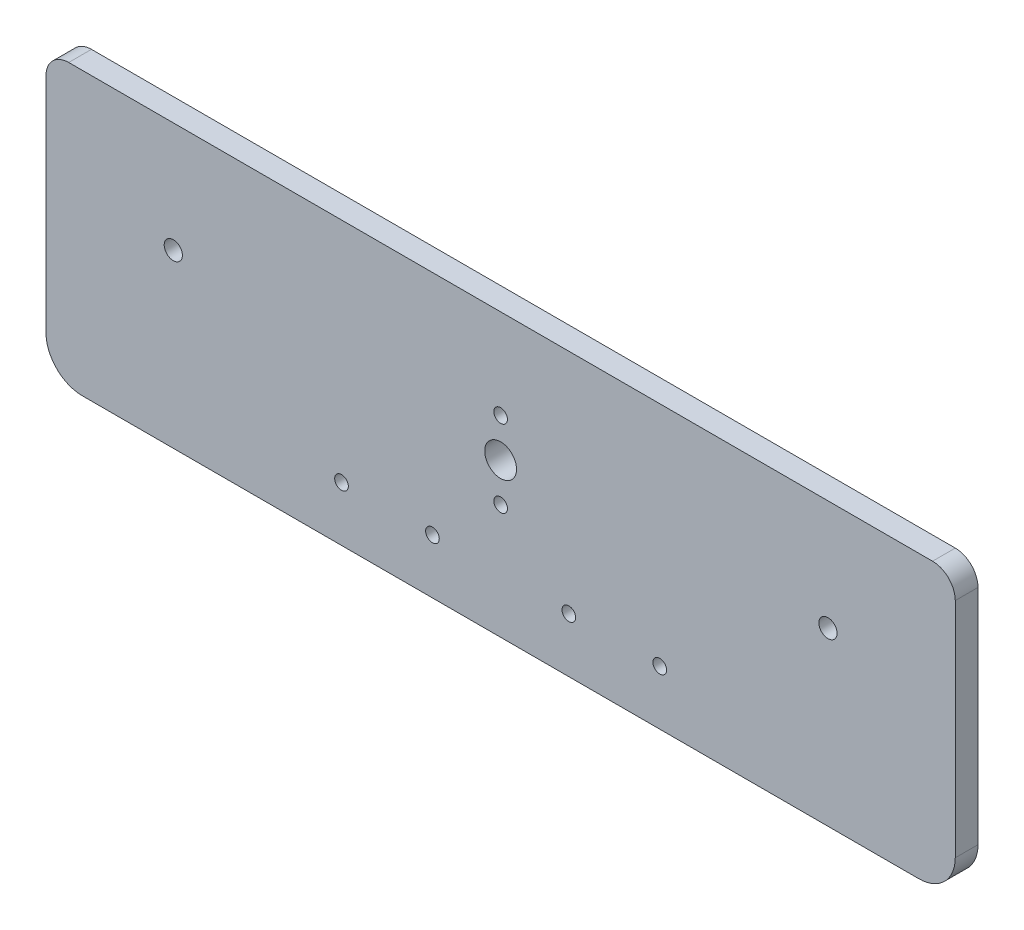
ISO-10303-21;
HEADER;
FILE_DESCRIPTION(('STEP AP214'),'2;1');
FILE_NAME('part.step','',(''),(''),'','','');
FILE_SCHEMA(('AUTOMOTIVE_DESIGN { 1 0 10303 214 1 1 1 1 }'));
ENDSEC;
DATA;
#1=APPLICATION_CONTEXT('core data for automotive mechanical design processes');
#2=APPLICATION_PROTOCOL_DEFINITION('international standard','automotive_design',2000,#1);
#3=PRODUCT_CONTEXT('',#1,'mechanical');
#4=PRODUCT('Part','Part','',(#3));
#5=PRODUCT_RELATED_PRODUCT_CATEGORY('part','',(#4));
#6=PRODUCT_DEFINITION_FORMATION('','',#4);
#7=PRODUCT_DEFINITION_CONTEXT('part definition',#1,'design');
#8=PRODUCT_DEFINITION('design','',#6,#7);
#9=PRODUCT_DEFINITION_SHAPE('','',#8);
#10=(LENGTH_UNIT() NAMED_UNIT(*) SI_UNIT(.MILLI.,.METRE.));
#11=(NAMED_UNIT(*) PLANE_ANGLE_UNIT() SI_UNIT($,.RADIAN.));
#12=(NAMED_UNIT(*) SI_UNIT($,.STERADIAN.) SOLID_ANGLE_UNIT());
#13=UNCERTAINTY_MEASURE_WITH_UNIT(LENGTH_MEASURE(1.E-05),#10,'distance_accuracy_value','');
#14=(GEOMETRIC_REPRESENTATION_CONTEXT(3) GLOBAL_UNCERTAINTY_ASSIGNED_CONTEXT((#13)) GLOBAL_UNIT_ASSIGNED_CONTEXT((#10,
#11,#12)) REPRESENTATION_CONTEXT('',''));
#15=CARTESIAN_POINT('',(0.,0.,0.));
#16=DIRECTION('',(0.,0.,1.));
#17=DIRECTION('',(1.,0.,0.));
#18=AXIS2_PLACEMENT_3D('',#15,#16,#17);
#19=CARTESIAN_POINT('',(-100.,0.,5.));
#20=DIRECTION('',(1.,0.,0.));
#21=DIRECTION('',(0.,0.,-1.));
#22=AXIS2_PLACEMENT_3D('',#19,#20,#21);
#23=PLANE('',#22);
#24=DIRECTION('',(0.,-1.,0.));
#25=VECTOR('',#24,1.);
#26=CARTESIAN_POINT('',(-100.,0.,5.));
#27=LINE('',#26,#25);
#28=CARTESIAN_POINT('',(-100.,0.,5.));
#29=VERTEX_POINT('',#28);
#30=CARTESIAN_POINT('',(-100.,-49.,5.));
#31=VERTEX_POINT('',#30);
#32=EDGE_CURVE('E103',#29,#31,#27,.T.);
#33=ORIENTED_EDGE('',*,*,#32,.F.);
#34=DIRECTION('',(0.,0.,-1.));
#35=VECTOR('',#34,1.);
#36=CARTESIAN_POINT('',(-100.,0.,0.));
#37=LINE('',#36,#35);
#38=CARTESIAN_POINT('',(-100.,0.,0.));
#39=VERTEX_POINT('',#38);
#40=EDGE_CURVE('E11',#29,#39,#37,.T.);
#41=ORIENTED_EDGE('',*,*,#40,.T.);
#42=DIRECTION('',(0.,-1.,0.));
#43=VECTOR('',#42,1.);
#44=CARTESIAN_POINT('',(-100.,0.,0.));
#45=LINE('',#44,#43);
#46=CARTESIAN_POINT('',(-100.,-49.,0.));
#47=VERTEX_POINT('',#46);
#48=EDGE_CURVE('E125',#39,#47,#45,.T.);
#49=ORIENTED_EDGE('',*,*,#48,.T.);
#50=DIRECTION('',(0.,0.,-1.));
#51=VECTOR('',#50,1.);
#52=CARTESIAN_POINT('',(-100.,-49.,5.));
#53=LINE('',#52,#51);
#54=EDGE_CURVE('E119',#31,#47,#53,.T.);
#55=ORIENTED_EDGE('',*,*,#54,.F.);
#56=EDGE_LOOP('',(#33,#41,#49,#55));
#57=FACE_BOUND('',#56,.T.);
#58=ADVANCED_FACE('F39',(#57),#23,.F.);
#59=CARTESIAN_POINT('',(-92.,-49.,5.));
#60=DIRECTION('',(0.,0.,-1.));
#61=DIRECTION('',(-1.,0.,0.));
#62=AXIS2_PLACEMENT_3D('',#59,#60,#61);
#63=CYLINDRICAL_SURFACE('',#62,8.);
#64=CARTESIAN_POINT('',(-92.,-49.,0.));
#65=DIRECTION('',(0.,0.,1.));
#66=DIRECTION('',(1.,0.,0.));
#67=AXIS2_PLACEMENT_3D('',#64,#65,#66);
#68=CIRCLE('',#67,8.);
#69=CARTESIAN_POINT('',(-92.,-57.,0.));
#70=VERTEX_POINT('',#69);
#71=EDGE_CURVE('E187',#47,#70,#68,.T.);
#72=ORIENTED_EDGE('',*,*,#71,.T.);
#73=DIRECTION('',(0.,0.,-1.));
#74=VECTOR('',#73,1.);
#75=CARTESIAN_POINT('',(-92.,-57.,5.));
#76=LINE('',#75,#74);
#77=CARTESIAN_POINT('',(-92.,-57.,5.));
#78=VERTEX_POINT('',#77);
#79=EDGE_CURVE('E120',#78,#70,#76,.T.);
#80=ORIENTED_EDGE('',*,*,#79,.F.);
#81=CARTESIAN_POINT('',(-92.,-49.,5.));
#82=DIRECTION('',(0.,0.,1.));
#83=DIRECTION('',(1.,0.,0.));
#84=AXIS2_PLACEMENT_3D('',#81,#82,#83);
#85=CIRCLE('',#84,8.);
#86=EDGE_CURVE('E108',#31,#78,#85,.T.);
#87=ORIENTED_EDGE('',*,*,#86,.F.);
#88=ORIENTED_EDGE('',*,*,#54,.T.);
#89=EDGE_LOOP('',(#72,#80,#87,#88));
#90=FACE_BOUND('',#89,.T.);
#91=ADVANCED_FACE('F118',(#90),#63,.T.);
#92=CARTESIAN_POINT('',(0.,-57.,5.));
#93=DIRECTION('',(0.,-1.,0.));
#94=DIRECTION('',(1.,0.,0.));
#95=AXIS2_PLACEMENT_3D('',#92,#93,#94);
#96=PLANE('',#95);
#97=DIRECTION('',(-1.,0.,0.));
#98=VECTOR('',#97,1.);
#99=CARTESIAN_POINT('',(0.,-57.,0.));
#100=LINE('',#99,#98);
#101=CARTESIAN_POINT('',(92.,-57.,0.));
#102=VERTEX_POINT('',#101);
#103=EDGE_CURVE('E172',#102,#70,#100,.T.);
#104=ORIENTED_EDGE('',*,*,#103,.F.);
#105=DIRECTION('',(0.,0.,-1.));
#106=VECTOR('',#105,1.);
#107=CARTESIAN_POINT('',(92.,-57.,5.));
#108=LINE('',#107,#106);
#109=CARTESIAN_POINT('',(92.,-57.,5.));
#110=VERTEX_POINT('',#109);
#111=EDGE_CURVE('E131',#110,#102,#108,.T.);
#112=ORIENTED_EDGE('',*,*,#111,.F.);
#113=DIRECTION('',(-1.,0.,0.));
#114=VECTOR('',#113,1.);
#115=CARTESIAN_POINT('',(0.,-57.,5.));
#116=LINE('',#115,#114);
#117=EDGE_CURVE('E122',#110,#78,#116,.T.);
#118=ORIENTED_EDGE('',*,*,#117,.T.);
#119=ORIENTED_EDGE('',*,*,#79,.T.);
#120=EDGE_LOOP('',(#104,#112,#118,#119));
#121=FACE_BOUND('',#120,.T.);
#122=ADVANCED_FACE('F186',(#121),#96,.T.);
#123=CARTESIAN_POINT('',(92.,-49.,5.));
#124=DIRECTION('',(0.,0.,-1.));
#125=DIRECTION('',(-1.,0.,0.));
#126=AXIS2_PLACEMENT_3D('',#123,#124,#125);
#127=CYLINDRICAL_SURFACE('',#126,8.);
#128=CARTESIAN_POINT('',(92.,-49.,0.));
#129=DIRECTION('',(0.,0.,1.));
#130=DIRECTION('',(1.,0.,0.));
#131=AXIS2_PLACEMENT_3D('',#128,#129,#130);
#132=CIRCLE('',#131,8.);
#133=CARTESIAN_POINT('',(100.,-49.,0.));
#134=VERTEX_POINT('',#133);
#135=EDGE_CURVE('E168',#134,#102,#132,.F.);
#136=ORIENTED_EDGE('',*,*,#135,.F.);
#137=DIRECTION('',(0.,0.,-1.));
#138=VECTOR('',#137,1.);
#139=CARTESIAN_POINT('',(100.,-49.,5.));
#140=LINE('',#139,#138);
#141=CARTESIAN_POINT('',(100.,-49.,5.));
#142=VERTEX_POINT('',#141);
#143=EDGE_CURVE('E166',#142,#134,#140,.T.);
#144=ORIENTED_EDGE('',*,*,#143,.F.);
#145=CARTESIAN_POINT('',(92.,-49.,5.));
#146=DIRECTION('',(0.,0.,1.));
#147=DIRECTION('',(1.,0.,0.));
#148=AXIS2_PLACEMENT_3D('',#145,#146,#147);
#149=CIRCLE('',#148,8.);
#150=EDGE_CURVE('E183',#142,#110,#149,.F.);
#151=ORIENTED_EDGE('',*,*,#150,.T.);
#152=ORIENTED_EDGE('',*,*,#111,.T.);
#153=EDGE_LOOP('',(#136,#144,#151,#152));
#154=FACE_BOUND('',#153,.T.);
#155=ADVANCED_FACE('F182',(#154),#127,.T.);
#156=CARTESIAN_POINT('',(100.,0.,5.));
#157=DIRECTION('',(1.,0.,0.));
#158=DIRECTION('',(0.,0.,-1.));
#159=AXIS2_PLACEMENT_3D('',#156,#157,#158);
#160=PLANE('',#159);
#161=DIRECTION('',(0.,-1.,0.));
#162=VECTOR('',#161,1.);
#163=CARTESIAN_POINT('',(100.,0.,0.));
#164=LINE('',#163,#162);
#165=CARTESIAN_POINT('',(100.,0.,0.));
#166=VERTEX_POINT('',#165);
#167=EDGE_CURVE('E161',#166,#134,#164,.T.);
#168=ORIENTED_EDGE('',*,*,#167,.F.);
#169=DIRECTION('',(0.,0.,-1.));
#170=VECTOR('',#169,1.);
#171=CARTESIAN_POINT('',(100.,0.,5.));
#172=LINE('',#171,#170);
#173=CARTESIAN_POINT('',(100.,0.,5.));
#174=VERTEX_POINT('',#173);
#175=EDGE_CURVE('E62',#166,#174,#172,.F.);
#176=ORIENTED_EDGE('',*,*,#175,.T.);
#177=DIRECTION('',(0.,-1.,0.));
#178=VECTOR('',#177,1.);
#179=CARTESIAN_POINT('',(100.,0.,5.));
#180=LINE('',#179,#178);
#181=EDGE_CURVE('E146',#174,#142,#180,.T.);
#182=ORIENTED_EDGE('',*,*,#181,.T.);
#183=ORIENTED_EDGE('',*,*,#143,.T.);
#184=EDGE_LOOP('',(#168,#176,#182,#183));
#185=FACE_BOUND('',#184,.T.);
#186=ADVANCED_FACE('F164',(#185),#160,.T.);
#187=CARTESIAN_POINT('',(0.,5.00000000000001,5.));
#188=DIRECTION('',(0.,1.,0.));
#189=DIRECTION('',(-1.,0.,0.));
#190=AXIS2_PLACEMENT_3D('',#187,#188,#189);
#191=PLANE('',#190);
#192=DIRECTION('',(1.,0.,0.));
#193=VECTOR('',#192,1.);
#194=CARTESIAN_POINT('',(0.,5.00000000000001,5.));
#195=LINE('',#194,#193);
#196=CARTESIAN_POINT('',(-95.,5.,5.));
#197=VERTEX_POINT('',#196);
#198=CARTESIAN_POINT('',(95.,5.00000000000002,5.));
#199=VERTEX_POINT('',#198);
#200=EDGE_CURVE('E144',#197,#199,#195,.T.);
#201=ORIENTED_EDGE('',*,*,#200,.T.);
#202=DIRECTION('',(0.,0.,-1.));
#203=VECTOR('',#202,1.);
#204=CARTESIAN_POINT('',(95.,5.00000000000002,5.));
#205=LINE('',#204,#203);
#206=CARTESIAN_POINT('',(95.,5.00000000000002,0.));
#207=VERTEX_POINT('',#206);
#208=EDGE_CURVE('E129',#199,#207,#205,.T.);
#209=ORIENTED_EDGE('',*,*,#208,.T.);
#210=DIRECTION('',(1.,0.,0.));
#211=VECTOR('',#210,1.);
#212=CARTESIAN_POINT('',(0.,5.00000000000001,0.));
#213=LINE('',#212,#211);
#214=CARTESIAN_POINT('',(-95.,5.,0.));
#215=VERTEX_POINT('',#214);
#216=EDGE_CURVE('E163',#215,#207,#213,.T.);
#217=ORIENTED_EDGE('',*,*,#216,.F.);
#218=DIRECTION('',(0.,0.,-1.));
#219=VECTOR('',#218,1.);
#220=CARTESIAN_POINT('',(-95.,5.,5.));
#221=LINE('',#220,#219);
#222=EDGE_CURVE('E127',#215,#197,#221,.F.);
#223=ORIENTED_EDGE('',*,*,#222,.T.);
#224=EDGE_LOOP('',(#201,#209,#217,#223));
#225=FACE_BOUND('',#224,.T.);
#226=ADVANCED_FACE('F150',(#225),#191,.T.);
#227=CARTESIAN_POINT('',(0.,-23.25,5.));
#228=DIRECTION('',(0.,0.,-1.));
#229=DIRECTION('',(-1.,0.,0.));
#230=AXIS2_PLACEMENT_3D('',#227,#228,#229);
#231=CYLINDRICAL_SURFACE('',#230,3.5);
#232=CARTESIAN_POINT('',(0.,-23.25,5.));
#233=DIRECTION('',(0.,0.,1.));
#234=DIRECTION('',(1.,0.,0.));
#235=AXIS2_PLACEMENT_3D('',#232,#233,#234);
#236=CIRCLE('',#235,3.5);
#237=CARTESIAN_POINT('',(3.50000000000002,-23.25,5.));
#238=VERTEX_POINT('',#237);
#239=EDGE_CURVE('E113',#238,#238,#236,.T.);
#240=ORIENTED_EDGE('',*,*,#239,.T.);
#241=EDGE_LOOP('',(#240));
#242=FACE_BOUND('',#241,.T.);
#243=CARTESIAN_POINT('',(0.,-23.25,0.));
#244=DIRECTION('',(0.,0.,1.));
#245=DIRECTION('',(1.,0.,0.));
#246=AXIS2_PLACEMENT_3D('',#243,#244,#245);
#247=CIRCLE('',#246,3.5);
#248=CARTESIAN_POINT('',(3.50000000000002,-23.25,0.));
#249=VERTEX_POINT('',#248);
#250=EDGE_CURVE('E191',#249,#249,#247,.T.);
#251=ORIENTED_EDGE('',*,*,#250,.F.);
#252=EDGE_LOOP('',(#251));
#253=FACE_BOUND('',#252,.T.);
#254=ADVANCED_FACE('F270',(#242,#253),#231,.F.);
#255=CARTESIAN_POINT('',(72.,-19.25,5.));
#256=DIRECTION('',(0.,0.,-1.));
#257=DIRECTION('',(-1.,0.,0.));
#258=AXIS2_PLACEMENT_3D('',#255,#256,#257);
#259=CYLINDRICAL_SURFACE('',#258,2.);
#260=CARTESIAN_POINT('',(72.,-19.25,5.));
#261=DIRECTION('',(0.,0.,1.));
#262=DIRECTION('',(1.,0.,0.));
#263=AXIS2_PLACEMENT_3D('',#260,#261,#262);
#264=CIRCLE('',#263,2.);
#265=CARTESIAN_POINT('',(74.,-19.25,5.));
#266=VERTEX_POINT('',#265);
#267=EDGE_CURVE('E217',#266,#266,#264,.T.);
#268=ORIENTED_EDGE('',*,*,#267,.T.);
#269=EDGE_LOOP('',(#268));
#270=FACE_BOUND('',#269,.T.);
#271=CARTESIAN_POINT('',(72.,-19.25,0.));
#272=DIRECTION('',(0.,0.,1.));
#273=DIRECTION('',(1.,0.,0.));
#274=AXIS2_PLACEMENT_3D('',#271,#272,#273);
#275=CIRCLE('',#274,2.);
#276=CARTESIAN_POINT('',(74.,-19.25,0.));
#277=VERTEX_POINT('',#276);
#278=EDGE_CURVE('E194',#277,#277,#275,.T.);
#279=ORIENTED_EDGE('',*,*,#278,.F.);
#280=EDGE_LOOP('',(#279));
#281=FACE_BOUND('',#280,.T.);
#282=ADVANCED_FACE('F273',(#270,#281),#259,.F.);
#283=CARTESIAN_POINT('',(-72.,-19.25,5.));
#284=DIRECTION('',(0.,0.,-1.));
#285=DIRECTION('',(-1.,0.,0.));
#286=AXIS2_PLACEMENT_3D('',#283,#284,#285);
#287=CYLINDRICAL_SURFACE('',#286,2.);
#288=CARTESIAN_POINT('',(-72.,-19.25,5.));
#289=DIRECTION('',(0.,0.,1.));
#290=DIRECTION('',(1.,0.,0.));
#291=AXIS2_PLACEMENT_3D('',#288,#289,#290);
#292=CIRCLE('',#291,2.);
#293=CARTESIAN_POINT('',(-70.,-19.25,5.));
#294=VERTEX_POINT('',#293);
#295=EDGE_CURVE('E220',#294,#294,#292,.F.);
#296=ORIENTED_EDGE('',*,*,#295,.F.);
#297=EDGE_LOOP('',(#296));
#298=FACE_BOUND('',#297,.T.);
#299=CARTESIAN_POINT('',(-72.,-19.25,0.));
#300=DIRECTION('',(0.,0.,1.));
#301=DIRECTION('',(1.,0.,0.));
#302=AXIS2_PLACEMENT_3D('',#299,#300,#301);
#303=CIRCLE('',#302,2.);
#304=CARTESIAN_POINT('',(-70.,-19.25,0.));
#305=VERTEX_POINT('',#304);
#306=EDGE_CURVE('E197',#305,#305,#303,.F.);
#307=ORIENTED_EDGE('',*,*,#306,.T.);
#308=EDGE_LOOP('',(#307));
#309=FACE_BOUND('',#308,.T.);
#310=ADVANCED_FACE('F293',(#298,#309),#287,.F.);
#311=CARTESIAN_POINT('',(15.,-45.,5.));
#312=DIRECTION('',(0.,0.,-1.));
#313=DIRECTION('',(-1.,0.,0.));
#314=AXIS2_PLACEMENT_3D('',#311,#312,#313);
#315=CYLINDRICAL_SURFACE('',#314,1.5);
#316=CARTESIAN_POINT('',(15.,-45.,5.));
#317=DIRECTION('',(0.,0.,1.));
#318=DIRECTION('',(1.,0.,0.));
#319=AXIS2_PLACEMENT_3D('',#316,#317,#318);
#320=CIRCLE('',#319,1.5);
#321=CARTESIAN_POINT('',(16.5,-45.,5.));
#322=VERTEX_POINT('',#321);
#323=EDGE_CURVE('E223',#322,#322,#320,.T.);
#324=ORIENTED_EDGE('',*,*,#323,.T.);
#325=EDGE_LOOP('',(#324));
#326=FACE_BOUND('',#325,.T.);
#327=CARTESIAN_POINT('',(15.,-45.,0.));
#328=DIRECTION('',(0.,0.,1.));
#329=DIRECTION('',(1.,0.,0.));
#330=AXIS2_PLACEMENT_3D('',#327,#328,#329);
#331=CIRCLE('',#330,1.5);
#332=CARTESIAN_POINT('',(16.5,-45.,0.));
#333=VERTEX_POINT('',#332);
#334=EDGE_CURVE('E200',#333,#333,#331,.T.);
#335=ORIENTED_EDGE('',*,*,#334,.F.);
#336=EDGE_LOOP('',(#335));
#337=FACE_BOUND('',#336,.T.);
#338=ADVANCED_FACE('F297',(#326,#337),#315,.F.);
#339=CARTESIAN_POINT('',(35.,-45.,5.));
#340=DIRECTION('',(0.,0.,-1.));
#341=DIRECTION('',(-1.,0.,0.));
#342=AXIS2_PLACEMENT_3D('',#339,#340,#341);
#343=CYLINDRICAL_SURFACE('',#342,1.5);
#344=CARTESIAN_POINT('',(35.,-45.,5.));
#345=DIRECTION('',(0.,0.,1.));
#346=DIRECTION('',(1.,0.,0.));
#347=AXIS2_PLACEMENT_3D('',#344,#345,#346);
#348=CIRCLE('',#347,1.5);
#349=CARTESIAN_POINT('',(36.5,-45.,5.));
#350=VERTEX_POINT('',#349);
#351=EDGE_CURVE('E226',#350,#350,#348,.T.);
#352=ORIENTED_EDGE('',*,*,#351,.T.);
#353=EDGE_LOOP('',(#352));
#354=FACE_BOUND('',#353,.T.);
#355=CARTESIAN_POINT('',(35.,-45.,0.));
#356=DIRECTION('',(0.,0.,1.));
#357=DIRECTION('',(1.,0.,0.));
#358=AXIS2_PLACEMENT_3D('',#355,#356,#357);
#359=CIRCLE('',#358,1.5);
#360=CARTESIAN_POINT('',(36.5,-45.,0.));
#361=VERTEX_POINT('',#360);
#362=EDGE_CURVE('E203',#361,#361,#359,.T.);
#363=ORIENTED_EDGE('',*,*,#362,.F.);
#364=EDGE_LOOP('',(#363));
#365=FACE_BOUND('',#364,.T.);
#366=ADVANCED_FACE('F301',(#354,#365),#343,.F.);
#367=CARTESIAN_POINT('',(-35.,-45.,5.));
#368=DIRECTION('',(0.,0.,-1.));
#369=DIRECTION('',(-1.,0.,0.));
#370=AXIS2_PLACEMENT_3D('',#367,#368,#369);
#371=CYLINDRICAL_SURFACE('',#370,1.5);
#372=CARTESIAN_POINT('',(-35.,-45.,5.));
#373=DIRECTION('',(0.,0.,1.));
#374=DIRECTION('',(1.,0.,0.));
#375=AXIS2_PLACEMENT_3D('',#372,#373,#374);
#376=CIRCLE('',#375,1.5);
#377=CARTESIAN_POINT('',(-33.5,-45.,5.));
#378=VERTEX_POINT('',#377);
#379=EDGE_CURVE('E178',#378,#378,#376,.F.);
#380=ORIENTED_EDGE('',*,*,#379,.F.);
#381=EDGE_LOOP('',(#380));
#382=FACE_BOUND('',#381,.T.);
#383=CARTESIAN_POINT('',(-35.,-45.,0.));
#384=DIRECTION('',(0.,0.,1.));
#385=DIRECTION('',(1.,0.,0.));
#386=AXIS2_PLACEMENT_3D('',#383,#384,#385);
#387=CIRCLE('',#386,1.5);
#388=CARTESIAN_POINT('',(-33.5,-45.,0.));
#389=VERTEX_POINT('',#388);
#390=EDGE_CURVE('E206',#389,#389,#387,.F.);
#391=ORIENTED_EDGE('',*,*,#390,.T.);
#392=EDGE_LOOP('',(#391));
#393=FACE_BOUND('',#392,.T.);
#394=ADVANCED_FACE('F305',(#382,#393),#371,.F.);
#395=CARTESIAN_POINT('',(-15.,-45.,5.));
#396=DIRECTION('',(0.,0.,-1.));
#397=DIRECTION('',(-1.,0.,0.));
#398=AXIS2_PLACEMENT_3D('',#395,#396,#397);
#399=CYLINDRICAL_SURFACE('',#398,1.5);
#400=CARTESIAN_POINT('',(-15.,-45.,5.));
#401=DIRECTION('',(0.,0.,1.));
#402=DIRECTION('',(1.,0.,0.));
#403=AXIS2_PLACEMENT_3D('',#400,#401,#402);
#404=CIRCLE('',#403,1.5);
#405=CARTESIAN_POINT('',(-13.5,-45.,5.));
#406=VERTEX_POINT('',#405);
#407=EDGE_CURVE('E154',#406,#406,#404,.F.);
#408=ORIENTED_EDGE('',*,*,#407,.F.);
#409=EDGE_LOOP('',(#408));
#410=FACE_BOUND('',#409,.T.);
#411=CARTESIAN_POINT('',(-15.,-45.,0.));
#412=DIRECTION('',(0.,0.,1.));
#413=DIRECTION('',(1.,0.,0.));
#414=AXIS2_PLACEMENT_3D('',#411,#412,#413);
#415=CIRCLE('',#414,1.5);
#416=CARTESIAN_POINT('',(-13.5,-45.,0.));
#417=VERTEX_POINT('',#416);
#418=EDGE_CURVE('E170',#417,#417,#415,.F.);
#419=ORIENTED_EDGE('',*,*,#418,.T.);
#420=EDGE_LOOP('',(#419));
#421=FACE_BOUND('',#420,.T.);
#422=ADVANCED_FACE('F254',(#410,#421),#399,.F.);
#423=CARTESIAN_POINT('',(0.,0.,5.));
#424=DIRECTION('',(0.,0.,1.));
#425=DIRECTION('',(1.,0.,0.));
#426=AXIS2_PLACEMENT_3D('',#423,#424,#425);
#427=PLANE('',#426);
#428=CARTESIAN_POINT('',(0.,-14.75,5.));
#429=DIRECTION('',(0.,0.,1.));
#430=DIRECTION('',(1.,0.,0.));
#431=AXIS2_PLACEMENT_3D('',#428,#429,#430);
#432=CIRCLE('',#431,1.5);
#433=CARTESIAN_POINT('',(1.5,-14.75,5.));
#434=VERTEX_POINT('',#433);
#435=EDGE_CURVE('E237',#434,#434,#432,.T.);
#436=ORIENTED_EDGE('',*,*,#435,.F.);
#437=EDGE_LOOP('',(#436));
#438=FACE_BOUND('',#437,.T.);
#439=CARTESIAN_POINT('',(0.,-31.75,5.));
#440=DIRECTION('',(0.,0.,1.));
#441=DIRECTION('',(1.,0.,0.));
#442=AXIS2_PLACEMENT_3D('',#439,#440,#441);
#443=CIRCLE('',#442,1.5);
#444=CARTESIAN_POINT('',(1.5,-31.75,5.));
#445=VERTEX_POINT('',#444);
#446=EDGE_CURVE('E234',#445,#445,#443,.T.);
#447=ORIENTED_EDGE('',*,*,#446,.F.);
#448=EDGE_LOOP('',(#447));
#449=FACE_BOUND('',#448,.T.);
#450=ORIENTED_EDGE('',*,*,#379,.T.);
#451=EDGE_LOOP('',(#450));
#452=FACE_BOUND('',#451,.T.);
#453=ORIENTED_EDGE('',*,*,#351,.F.);
#454=EDGE_LOOP('',(#453));
#455=FACE_BOUND('',#454,.T.);
#456=ORIENTED_EDGE('',*,*,#323,.F.);
#457=EDGE_LOOP('',(#456));
#458=FACE_BOUND('',#457,.T.);
#459=ORIENTED_EDGE('',*,*,#295,.T.);
#460=EDGE_LOOP('',(#459));
#461=FACE_BOUND('',#460,.T.);
#462=ORIENTED_EDGE('',*,*,#267,.F.);
#463=EDGE_LOOP('',(#462));
#464=FACE_BOUND('',#463,.T.);
#465=ORIENTED_EDGE('',*,*,#239,.F.);
#466=EDGE_LOOP('',(#465));
#467=FACE_BOUND('',#466,.T.);
#468=ORIENTED_EDGE('',*,*,#181,.F.);
#469=CARTESIAN_POINT('',(95.,0.,5.));
#470=DIRECTION('',(0.,0.,1.));
#471=DIRECTION('',(1.,0.,0.));
#472=AXIS2_PLACEMENT_3D('',#469,#470,#471);
#473=CIRCLE('',#472,5.);
#474=EDGE_CURVE('E47',#174,#199,#473,.T.);
#475=ORIENTED_EDGE('',*,*,#474,.T.);
#476=ORIENTED_EDGE('',*,*,#200,.F.);
#477=CARTESIAN_POINT('',(-95.,0.,5.));
#478=DIRECTION('',(0.,0.,1.));
#479=DIRECTION('',(1.,0.,0.));
#480=AXIS2_PLACEMENT_3D('',#477,#478,#479);
#481=CIRCLE('',#480,5.);
#482=EDGE_CURVE('E54',#197,#29,#481,.T.);
#483=ORIENTED_EDGE('',*,*,#482,.T.);
#484=ORIENTED_EDGE('',*,*,#32,.T.);
#485=ORIENTED_EDGE('',*,*,#86,.T.);
#486=ORIENTED_EDGE('',*,*,#117,.F.);
#487=ORIENTED_EDGE('',*,*,#150,.F.);
#488=EDGE_LOOP('',(#468,#475,#476,#483,#484,#485,#486,#487));
#489=FACE_BOUND('',#488,.T.);
#490=ORIENTED_EDGE('',*,*,#407,.T.);
#491=EDGE_LOOP('',(#490));
#492=FACE_BOUND('',#491,.T.);
#493=ADVANCED_FACE('F105',(#438,#449,#452,#455,#458,#461,#464,#467,#489,#492),#427,.T.);
#494=CARTESIAN_POINT('',(0.,0.,0.));
#495=DIRECTION('',(0.,0.,1.));
#496=DIRECTION('',(1.,0.,0.));
#497=AXIS2_PLACEMENT_3D('',#494,#495,#496);
#498=PLANE('',#497);
#499=CARTESIAN_POINT('',(0.,-14.75,0.));
#500=DIRECTION('',(0.,0.,1.));
#501=DIRECTION('',(1.,0.,0.));
#502=AXIS2_PLACEMENT_3D('',#499,#500,#501);
#503=CIRCLE('',#502,1.5);
#504=CARTESIAN_POINT('',(1.5,-14.75,0.));
#505=VERTEX_POINT('',#504);
#506=EDGE_CURVE('E209',#505,#505,#503,.T.);
#507=ORIENTED_EDGE('',*,*,#506,.T.);
#508=EDGE_LOOP('',(#507));
#509=FACE_BOUND('',#508,.T.);
#510=CARTESIAN_POINT('',(0.,-31.75,0.));
#511=DIRECTION('',(0.,0.,1.));
#512=DIRECTION('',(1.,0.,0.));
#513=AXIS2_PLACEMENT_3D('',#510,#511,#512);
#514=CIRCLE('',#513,1.5);
#515=CARTESIAN_POINT('',(1.5,-31.75,0.));
#516=VERTEX_POINT('',#515);
#517=EDGE_CURVE('E231',#516,#516,#514,.T.);
#518=ORIENTED_EDGE('',*,*,#517,.T.);
#519=EDGE_LOOP('',(#518));
#520=FACE_BOUND('',#519,.T.);
#521=ORIENTED_EDGE('',*,*,#390,.F.);
#522=EDGE_LOOP('',(#521));
#523=FACE_BOUND('',#522,.T.);
#524=ORIENTED_EDGE('',*,*,#362,.T.);
#525=EDGE_LOOP('',(#524));
#526=FACE_BOUND('',#525,.T.);
#527=ORIENTED_EDGE('',*,*,#334,.T.);
#528=EDGE_LOOP('',(#527));
#529=FACE_BOUND('',#528,.T.);
#530=ORIENTED_EDGE('',*,*,#306,.F.);
#531=EDGE_LOOP('',(#530));
#532=FACE_BOUND('',#531,.T.);
#533=ORIENTED_EDGE('',*,*,#278,.T.);
#534=EDGE_LOOP('',(#533));
#535=FACE_BOUND('',#534,.T.);
#536=ORIENTED_EDGE('',*,*,#250,.T.);
#537=EDGE_LOOP('',(#536));
#538=FACE_BOUND('',#537,.T.);
#539=ORIENTED_EDGE('',*,*,#216,.T.);
#540=CARTESIAN_POINT('',(95.,0.,0.));
#541=DIRECTION('',(0.,0.,1.));
#542=DIRECTION('',(1.,0.,0.));
#543=AXIS2_PLACEMENT_3D('',#540,#541,#542);
#544=CIRCLE('',#543,5.);
#545=EDGE_CURVE('E139',#207,#166,#544,.F.);
#546=ORIENTED_EDGE('',*,*,#545,.T.);
#547=ORIENTED_EDGE('',*,*,#167,.T.);
#548=ORIENTED_EDGE('',*,*,#135,.T.);
#549=ORIENTED_EDGE('',*,*,#103,.T.);
#550=ORIENTED_EDGE('',*,*,#71,.F.);
#551=ORIENTED_EDGE('',*,*,#48,.F.);
#552=CARTESIAN_POINT('',(-95.,0.,0.));
#553=DIRECTION('',(0.,0.,1.));
#554=DIRECTION('',(1.,0.,0.));
#555=AXIS2_PLACEMENT_3D('',#552,#553,#554);
#556=CIRCLE('',#555,5.);
#557=EDGE_CURVE('E137',#39,#215,#556,.F.);
#558=ORIENTED_EDGE('',*,*,#557,.T.);
#559=EDGE_LOOP('',(#539,#546,#547,#548,#549,#550,#551,#558));
#560=FACE_BOUND('',#559,.T.);
#561=ORIENTED_EDGE('',*,*,#418,.F.);
#562=EDGE_LOOP('',(#561));
#563=FACE_BOUND('',#562,.T.);
#564=ADVANCED_FACE('F158',(#509,#520,#523,#526,#529,#532,#535,#538,#560,#563),#498,.F.);
#565=CARTESIAN_POINT('',(95.,0.,5.));
#566=DIRECTION('',(0.,0.,-1.));
#567=DIRECTION('',(-1.,0.,0.));
#568=AXIS2_PLACEMENT_3D('',#565,#566,#567);
#569=CYLINDRICAL_SURFACE('',#568,5.);
#570=ORIENTED_EDGE('',*,*,#474,.F.);
#571=ORIENTED_EDGE('',*,*,#175,.F.);
#572=ORIENTED_EDGE('',*,*,#545,.F.);
#573=ORIENTED_EDGE('',*,*,#208,.F.);
#574=EDGE_LOOP('',(#570,#571,#572,#573));
#575=FACE_BOUND('',#574,.T.);
#576=ADVANCED_FACE('F156',(#575),#569,.T.);
#577=CARTESIAN_POINT('',(-95.,0.,5.));
#578=DIRECTION('',(0.,0.,1.));
#579=DIRECTION('',(1.,0.,0.));
#580=AXIS2_PLACEMENT_3D('',#577,#578,#579);
#581=CYLINDRICAL_SURFACE('',#580,5.);
#582=ORIENTED_EDGE('',*,*,#482,.F.);
#583=ORIENTED_EDGE('',*,*,#222,.F.);
#584=ORIENTED_EDGE('',*,*,#557,.F.);
#585=ORIENTED_EDGE('',*,*,#40,.F.);
#586=EDGE_LOOP('',(#582,#583,#584,#585));
#587=FACE_BOUND('',#586,.T.);
#588=ADVANCED_FACE('F41',(#587),#581,.T.);
#589=CARTESIAN_POINT('',(0.,-31.75,0.));
#590=DIRECTION('',(0.,0.,1.));
#591=DIRECTION('',(1.,0.,0.));
#592=AXIS2_PLACEMENT_3D('',#589,#590,#591);
#593=CYLINDRICAL_SURFACE('',#592,1.5);
#594=ORIENTED_EDGE('',*,*,#517,.F.);
#595=EDGE_LOOP('',(#594));
#596=FACE_BOUND('',#595,.T.);
#597=ORIENTED_EDGE('',*,*,#446,.T.);
#598=EDGE_LOOP('',(#597));
#599=FACE_BOUND('',#598,.T.);
#600=ADVANCED_FACE('F248',(#596,#599),#593,.F.);
#601=CARTESIAN_POINT('',(0.,-14.75,0.));
#602=DIRECTION('',(0.,0.,1.));
#603=DIRECTION('',(1.,0.,0.));
#604=AXIS2_PLACEMENT_3D('',#601,#602,#603);
#605=CYLINDRICAL_SURFACE('',#604,1.5);
#606=ORIENTED_EDGE('',*,*,#506,.F.);
#607=EDGE_LOOP('',(#606));
#608=FACE_BOUND('',#607,.T.);
#609=ORIENTED_EDGE('',*,*,#435,.T.);
#610=EDGE_LOOP('',(#609));
#611=FACE_BOUND('',#610,.T.);
#612=ADVANCED_FACE('F245',(#608,#611),#605,.F.);
#613=CLOSED_SHELL('',(#58,#91,#122,#155,#186,#226,#254,#282,#310,#338,#366,#394,#422,#493,#564,
#576,#588,#600,#612));
#614=MANIFOLD_SOLID_BREP('B2',#613);
#615=ADVANCED_BREP_SHAPE_REPRESENTATION('',(#18,#614),#14);
#616=SHAPE_DEFINITION_REPRESENTATION(#9,#615);
ENDSEC;
END-ISO-10303-21;
